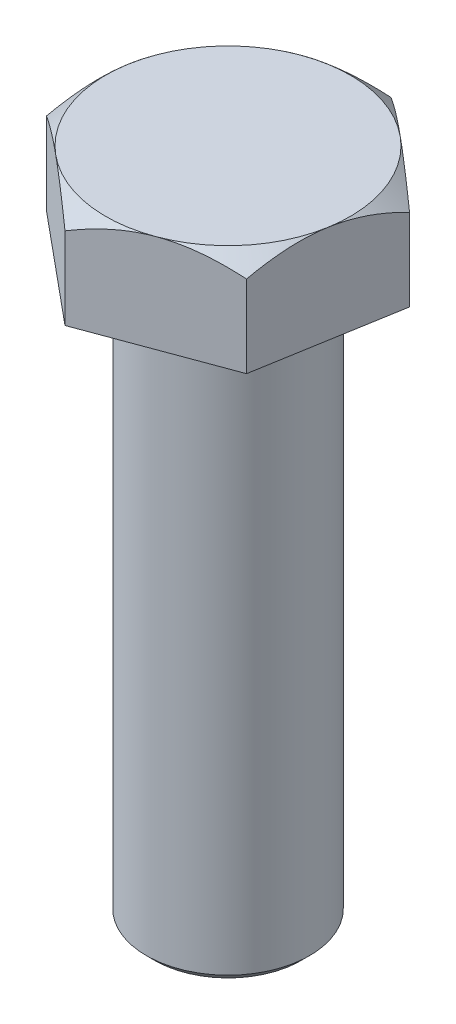
ISO-10303-21;
HEADER;
FILE_DESCRIPTION(('STEP AP214'),'2;1');
FILE_NAME('part.step','',(''),(''),'','','');
FILE_SCHEMA(('AUTOMOTIVE_DESIGN { 1 0 10303 214 1 1 1 1 }'));
ENDSEC;
DATA;
#1=APPLICATION_CONTEXT('core data for automotive mechanical design processes');
#2=APPLICATION_PROTOCOL_DEFINITION('international standard','automotive_design',2000,#1);
#3=PRODUCT_CONTEXT('',#1,'mechanical');
#4=PRODUCT('Part','Part','',(#3));
#5=PRODUCT_RELATED_PRODUCT_CATEGORY('part','',(#4));
#6=PRODUCT_DEFINITION_FORMATION('','',#4);
#7=PRODUCT_DEFINITION_CONTEXT('part definition',#1,'design');
#8=PRODUCT_DEFINITION('design','',#6,#7);
#9=PRODUCT_DEFINITION_SHAPE('','',#8);
#10=(LENGTH_UNIT() NAMED_UNIT(*) SI_UNIT(.MILLI.,.METRE.));
#11=(NAMED_UNIT(*) PLANE_ANGLE_UNIT() SI_UNIT($,.RADIAN.));
#12=(NAMED_UNIT(*) SI_UNIT($,.STERADIAN.) SOLID_ANGLE_UNIT());
#13=UNCERTAINTY_MEASURE_WITH_UNIT(LENGTH_MEASURE(1.E-05),#10,'distance_accuracy_value','');
#14=(GEOMETRIC_REPRESENTATION_CONTEXT(3) GLOBAL_UNCERTAINTY_ASSIGNED_CONTEXT((#13)) GLOBAL_UNIT_ASSIGNED_CONTEXT((#10,
#11,#12)) REPRESENTATION_CONTEXT('',''));
#15=CARTESIAN_POINT('',(0.,0.,0.));
#16=DIRECTION('',(0.,0.,1.));
#17=DIRECTION('',(1.,0.,0.));
#18=AXIS2_PLACEMENT_3D('',#15,#16,#17);
#19=CARTESIAN_POINT('',(-2.91048949961623,82.,17.0742218233401));
#20=DIRECTION('',(-0.347365853314628,0.,-0.937729685970856));
#21=DIRECTION('',(-0.937729685970856,0.,0.347365853314628));
#22=AXIS2_PLACEMENT_3D('',#19,#20,#21);
#23=PLANE('',#22);
#24=CARTESIAN_POINT('',(-2.91068949961623,80.0527730466816,17.0742959099044));
#25=CARTESIAN_POINT('',(-2.63722849280806,80.1751074607622,16.9729969776008));
#26=CARTESIAN_POINT('',(-2.36224444762258,80.2935214943959,16.871133861894));
#27=CARTESIAN_POINT('',(-1.80896899522368,80.5214922688724,16.6661824750329));
#28=CARTESIAN_POINT('',(-1.53067654049819,80.6310461138338,16.5630938158457));
#29=CARTESIAN_POINT('',(-0.689052885007393,80.9453954134312,16.2513287905584));
#30=CARTESIAN_POINT('',(-0.120595171194301,81.1351403804428,16.0407533957659));
#31=CARTESIAN_POINT('',(0.738870698550772,81.3814990590712,15.7223790287119));
#32=CARTESIAN_POINT('',(1.02519061514896,81.4569879752598,15.6163167341742));
#33=CARTESIAN_POINT('',(1.60064831431089,81.5944879006538,15.403148315059));
#34=CARTESIAN_POINT('',(1.88978567292479,81.6565009058753,15.2960423475263));
#35=CARTESIAN_POINT('',(2.47017506675641,81.7658776155034,15.0810470668401));
#36=CARTESIAN_POINT('',(2.76142448535048,81.8132570450953,14.9731587229699));
#37=CARTESIAN_POINT('',(3.34578219260528,81.8925108979478,14.756693448746));
#38=CARTESIAN_POINT('',(3.63889046594452,81.9243854488387,14.6481165240679));
#39=CARTESIAN_POINT('',(4.23132784873439,81.9723494228135,14.4286582728393));
#40=CARTESIAN_POINT('',(4.53067715063065,81.9881575070818,14.3177694663442));
#41=CARTESIAN_POINT('',(5.12974309034249,82.0026445803845,14.095855780073));
#42=CARTESIAN_POINT('',(5.42945972941784,82.0013235105099,13.9848308998303));
#43=CARTESIAN_POINT('',(6.02852063510496,81.9815794471626,13.762919078327));
#44=CARTESIAN_POINT('',(6.32786469164568,81.9631492490832,13.6520322148838));
#45=CARTESIAN_POINT('',(6.92522915410048,81.9096078749881,13.4307488116335));
#46=CARTESIAN_POINT('',(7.22324955480276,81.8744966333507,13.3203522737571));
#47=CARTESIAN_POINT('',(7.81729273779697,81.7883628980627,13.1002991814282));
#48=CARTESIAN_POINT('',(8.11331525256522,81.7373383151148,12.9906427260752));
#49=CARTESIAN_POINT('',(8.70278219758385,81.620418479962,12.7722848224911));
#50=CARTESIAN_POINT('',(8.99622621876246,81.5545209109178,12.6635835257936));
#51=CARTESIAN_POINT('',(9.87185097708019,81.3363504567128,12.3392233760544));
#52=CARTESIAN_POINT('',(10.4496059822361,81.1635569490721,12.125203959398));
#53=CARTESIAN_POINT('',(11.4126914110942,80.834573899571,11.7684455067062));
#54=CARTESIAN_POINT('',(11.8016625832438,80.6901081839901,11.6243578179511));
#55=CARTESIAN_POINT('',(12.3796979874146,80.4602652118119,11.4102345322966));
#56=CARTESIAN_POINT('',(12.5711265983243,80.3816164314127,11.3393230918546));
#57=CARTESIAN_POINT('',(12.9525071422213,80.2201971441955,11.1980472209396));
#58=CARTESIAN_POINT('',(13.1424586866377,80.1374255925657,11.1276829344061));
#59=CARTESIAN_POINT('',(13.3316650990551,80.0527730466816,11.0575946692213));
#60=B_SPLINE_CURVE_WITH_KNOTS('',3,(#24,#25,#26,#27,#28,#29,#30,#31,#32,#33,#34,#35,#36,#37,#38,
#39,#40,#41,#42,#43,#44,#45,#46,#47,#48,#49,#50,#51,#52,#53,#54,#55,#56,#57,#58,#59),
.UNSPECIFIED.,.F.,.F.,(4,2,2,2,2,2,2,2,2,2,2,2,2,2,2,2,2,4),(0.,0.948638219323454,
1.89758525081885,3.80110561467445,4.74444433951472,5.68764324413826,6.62982503574581,
7.57199907154818,8.53040109469999,9.48880641389845,10.4476154980877,11.4064283541823,
12.3653671479429,13.3244554236069,15.2417253713303,16.5590477208573,17.2153050562089,
17.8717295580449),.UNSPECIFIED.);
#61=CARTESIAN_POINT('',(-2.91048949961623,80.0528625295457,17.0742218233401));
#62=VERTEX_POINT('',#61);
#63=CARTESIAN_POINT('',(5.21048779971942,82.,14.0659452895628));
#64=VERTEX_POINT('',#63);
#65=EDGE_CURVE('E257',#62,#64,#60,.T.);
#66=ORIENTED_EDGE('',*,*,#65,.F.);
#67=DIRECTION('',(0.,-1.,0.));
#68=VECTOR('',#67,1.);
#69=CARTESIAN_POINT('',(-2.91048949961623,82.,17.0742218233401));
#70=LINE('',#69,#68);
#71=CARTESIAN_POINT('',(-2.91048949961623,70.,17.0742218233401));
#72=VERTEX_POINT('',#71);
#73=EDGE_CURVE('E240',#62,#72,#70,.T.);
#74=ORIENTED_EDGE('',*,*,#73,.T.);
#75=DIRECTION('',(0.937729685970856,0.,-0.347365853314628));
#76=VECTOR('',#75,1.);
#77=CARTESIAN_POINT('',(-2.91048949961623,70.,17.0742218233401));
#78=LINE('',#77,#76);
#79=CARTESIAN_POINT('',(13.3314650990551,70.,11.0576687557856));
#80=VERTEX_POINT('',#79);
#81=EDGE_CURVE('E255',#72,#80,#78,.T.);
#82=ORIENTED_EDGE('',*,*,#81,.T.);
#83=DIRECTION('',(0.,-1.,0.));
#84=VECTOR('',#83,1.);
#85=CARTESIAN_POINT('',(13.3314650990551,82.,11.0576687557856));
#86=LINE('',#85,#84);
#87=CARTESIAN_POINT('',(13.3314650990551,80.0528625295457,11.0576687557856));
#88=VERTEX_POINT('',#87);
#89=EDGE_CURVE('E229',#88,#80,#86,.T.);
#90=ORIENTED_EDGE('',*,*,#89,.F.);
#91=EDGE_CURVE('E110',#64,#88,#60,.T.);
#92=ORIENTED_EDGE('',*,*,#91,.F.);
#93=EDGE_LOOP('',(#66,#74,#82,#90,#92));
#94=FACE_BOUND('',#93,.T.);
#95=ADVANCED_FACE('F35',(#94),#23,.F.);
#96=CARTESIAN_POINT('',(13.3314650990551,82.,11.0576687557856));
#97=DIRECTION('',(-0.985780656590879,0.,-0.168037189607701));
#98=DIRECTION('',(-0.168037189607701,0.,0.98578065659088));
#99=AXIS2_PLACEMENT_3D('',#96,#97,#98);
#100=PLANE('',#99);
#101=CARTESIAN_POINT('',(13.3314310068484,80.0527774084797,11.0578687557856));
#102=CARTESIAN_POINT('',(13.3804340439078,80.1751116685097,10.7703952140046));
#103=CARTESIAN_POINT('',(13.4297100028762,80.2935255462614,10.481320591301));
#104=CARTESIAN_POINT('',(13.5288545857024,80.5214960056934,9.89969451088428));
#105=CARTESIAN_POINT('',(13.5787233972697,80.6310496914908,9.60714195198324));
#106=CARTESIAN_POINT('',(13.7295387374369,80.9453985074171,8.72239229983152));
#107=CARTESIAN_POINT('',(13.8314039146737,81.1351431458735,8.12480600637662));
#108=CARTESIAN_POINT('',(13.9854164998945,81.3815013336631,7.2212998971836));
#109=CARTESIAN_POINT('',(14.0367237966313,81.456990087447,6.92030854649965));
#110=CARTESIAN_POINT('',(14.139843338687,81.5944896902701,6.31536359287176));
#111=CARTESIAN_POINT('',(14.191655508036,81.6565025353249,6.01141043560062));
#112=CARTESIAN_POINT('',(14.295658786666,81.7658789298141,5.40128109140657));
#113=CARTESIAN_POINT('',(14.3478494270609,81.8132582044176,5.09510765517829));
#114=CARTESIAN_POINT('',(14.452563808196,81.8925117555329,4.48080666840968));
#115=CARTESIAN_POINT('',(14.5050875461906,81.9243861596748,4.17267913397589));
#116=CARTESIAN_POINT('',(14.6112497653494,81.9723498482744,3.54988448743512));
#117=CARTESIAN_POINT('',(14.6648918648812,81.9881577949395,3.23519614837816));
#118=CARTESIAN_POINT('',(14.7722418877871,82.002644610361,2.6054333184221));
#119=CARTESIAN_POINT('',(14.8259498113869,82.0013234202078,2.29035882619869));
#120=CARTESIAN_POINT('',(14.9332989301152,81.9815791364011,1.66060130054927));
#121=CARTESIAN_POINT('',(14.9869400875994,81.9631488381329,1.34591848796156));
#122=CARTESIAN_POINT('',(15.093985209366,81.9096072855675,0.71794434327188));
#123=CARTESIAN_POINT('',(15.1473891727145,81.8744959656491,0.404653016648746));
#124=CARTESIAN_POINT('',(15.253839134041,81.7883620965521,-0.21982965302379));
#125=CARTESIAN_POINT('',(15.3068850840822,81.7373374581819,-0.53102071485477));
#126=CARTESIAN_POINT('',(15.4125150023892,81.6204175342938,-1.1506926485944));
#127=CARTESIAN_POINT('',(15.4650988973512,81.554519931942,-1.45917309047011));
#128=CARTESIAN_POINT('',(15.6220070534571,81.3363494092117,-2.37966590227922));
#129=CARTESIAN_POINT('',(15.7255382426748,81.1635558975606,-2.98702576067084));
#130=CARTESIAN_POINT('',(15.898118619401,80.8345735698014,-3.99945876720383));
#131=CARTESIAN_POINT('',(15.9678202188422,80.6901086676054,-4.40835925300112));
#132=CARTESIAN_POINT('',(16.0714011449119,80.4602670552488,-5.01601088981842));
#133=CARTESIAN_POINT('',(16.1057041534893,80.3816187498422,-5.21724754699767));
#134=CARTESIAN_POINT('',(16.1740455591232,80.2202004543605,-5.61816853285409));
#135=CARTESIAN_POINT('',(16.2080838865501,80.137429419484,-5.81785245305382));
#136=CARTESIAN_POINT('',(16.241988690878,80.0527774084797,-6.01675306755454));
#137=B_SPLINE_CURVE_WITH_KNOTS('',3,(#101,#102,#103,#104,#105,#106,#107,#108,#109,#110,#111,
#112,#113,#114,#115,#116,#117,#118,#119,#120,#121,#122,#123,#124,#125,#126,#127,#128,#129,#130,
#131,#132,#133,#134,#135,#136),.UNSPECIFIED.,.F.,.F.,(4,2,2,2,2,2,2,2,2,2,2,2,2,2,2,2,2,4),(0.,
0.948637750852713,1.89758431376006,3.80110372841824,4.74444198780448,5.68764042706563,
6.62982175449487,7.57199532611947,8.5303968302554,9.48880163047824,10.4476101964009,
11.4064225341971,12.3653608033915,13.3244485542859,15.2417174502279,16.5590324667956,
17.2152861578204,17.8717070143951),.UNSPECIFIED.);
#138=CARTESIAN_POINT('',(14.7867098488632,82.,2.52055784411552));
#139=VERTEX_POINT('',#138);
#140=EDGE_CURVE('E106',#88,#139,#137,.T.);
#141=ORIENTED_EDGE('',*,*,#140,.F.);
#142=ORIENTED_EDGE('',*,*,#89,.T.);
#143=DIRECTION('',(0.168037189607701,0.,-0.98578065659088));
#144=VECTOR('',#143,1.);
#145=CARTESIAN_POINT('',(13.3314650990551,70.,11.0576687557856));
#146=LINE('',#145,#144);
#147=CARTESIAN_POINT('',(16.2419545986713,70.,-6.01655306755454));
#148=VERTEX_POINT('',#147);
#149=EDGE_CURVE('E254',#80,#148,#146,.T.);
#150=ORIENTED_EDGE('',*,*,#149,.T.);
#151=DIRECTION('',(0.,-1.,0.));
#152=VECTOR('',#151,1.);
#153=CARTESIAN_POINT('',(16.2419545986713,82.,-6.01655306755454));
#154=LINE('',#153,#152);
#155=CARTESIAN_POINT('',(16.2419545986713,80.0528625295457,-6.01655306755454));
#156=VERTEX_POINT('',#155);
#157=EDGE_CURVE('E134',#156,#148,#154,.T.);
#158=ORIENTED_EDGE('',*,*,#157,.F.);
#159=EDGE_CURVE('E114',#139,#156,#137,.T.);
#160=ORIENTED_EDGE('',*,*,#159,.F.);
#161=EDGE_LOOP('',(#141,#142,#150,#158,#160));
#162=FACE_BOUND('',#161,.T.);
#163=ADVANCED_FACE('F132',(#162),#100,.F.);
#164=CARTESIAN_POINT('',(16.2419545986713,82.,-6.01655306755454));
#165=DIRECTION('',(-0.638414803276251,0.,0.769692496363155));
#166=DIRECTION('',(0.769692496363155,0.,0.638414803276251));
#167=AXIS2_PLACEMENT_3D('',#164,#165,#166);
#168=PLANE('',#167);
#169=CARTESIAN_POINT('',(16.2421545986713,80.0527535108043,-6.01638717927934));
#170=CARTESIAN_POINT('',(16.0176962855806,80.1750886148536,-6.20256219134276));
#171=CARTESIAN_POINT('',(15.7919878536772,80.2935033466592,-6.38977410367426));
#172=CARTESIAN_POINT('',(15.3378562852475,80.5214755321717,-6.76644961667527));
#173=CARTESIAN_POINT('',(15.1094322889166,80.6310300900033,-6.95591393050213));
#174=CARTESIAN_POINT('',(14.4186228872168,80.9453815558897,-7.52889983119814));
#175=CARTESIAN_POINT('',(13.952029601888,81.1351279944501,-7.91591160781117));
#176=CARTESIAN_POINT('',(13.2465751490001,81.3814888714715,-8.50104471991603));
#177=CARTESIAN_POINT('',(13.0115621367057,81.4569785150467,-8.69597423621016));
#178=CARTESIAN_POINT('',(12.5392231738735,81.5944798851873,-9.08775171547768));
#179=CARTESIAN_POINT('',(12.3018975713189,81.6564936077718,-9.2845993898193));
#180=CARTESIAN_POINT('',(11.8255106068562,81.7658717288613,-9.67973444912917));
#181=CARTESIAN_POINT('',(11.5864513927174,81.8132518526228,-9.87802005264871));
#182=CARTESIAN_POINT('',(11.1068071693372,81.892507056913,-10.2758568172771));
#183=CARTESIAN_POINT('',(10.8662221726721,81.9243822650718,-10.4754079679547));
#184=CARTESIAN_POINT('',(10.3799460020094,81.9723475172014,-10.8787455440625));
#185=CARTESIAN_POINT('',(10.1342382532914,81.9881562177754,-11.0825457172518));
#186=CARTESIAN_POINT('',(9.64252122037137,82.0026444460923,-11.490396169637));
#187=CARTESIAN_POINT('',(9.3965119351353,82.0013239149293,-11.6944464496907));
#188=CARTESIAN_POINT('',(8.90479899104735,81.9815808389896,-12.1022935106294));
#189=CARTESIAN_POINT('',(8.65909550461277,81.9631510896425,-12.3060901485044));
#190=CARTESIAN_POINT('',(8.16877497719508,81.9096105148924,-12.7127822814442));
#191=CARTESIAN_POINT('',(7.92415794048993,81.8744996238649,-12.9156777729606));
#192=CARTESIAN_POINT('',(7.43656350823905,81.7883664878905,-13.3201087697741));
#193=CARTESIAN_POINT('',(7.19358633232558,81.7373421531724,-13.5216440928991));
#194=CARTESIAN_POINT('',(6.70974808431947,81.6204227154544,-13.9229595550842));
#195=CARTESIAN_POINT('',(6.4688873479961,81.5545252955913,-14.1227394156433));
#196=CARTESIAN_POINT('',(5.75016892298487,81.3363551483041,-14.7188742150374));
#197=CARTESIAN_POINT('',(5.27594390426297,81.1635616586271,-15.1122160670972));
#198=CARTESIAN_POINT('',(4.48542997935495,80.8345753765618,-15.7679010247159));
#199=CARTESIAN_POINT('',(4.16615283862262,80.6901060179509,-16.0327226956485));
#200=CARTESIAN_POINT('',(3.69168721538254,80.4602569553264,-16.426264115051));
#201=CARTESIAN_POINT('',(3.5345579434751,80.3816060475016,-16.5565936345509));
#202=CARTESIAN_POINT('',(3.22151152286955,80.2201823184395,-16.8162472884082));
#203=CARTESIAN_POINT('',(3.06559469312752,80.1374084523426,-16.9455711582102));
#204=CARTESIAN_POINT('',(2.91028949961624,80.0527535108043,-17.0743877116153));
#205=B_SPLINE_CURVE_WITH_KNOTS('',3,(#169,#170,#171,#172,#173,#174,#175,#176,#177,#178,#179,
#180,#181,#182,#183,#184,#185,#186,#187,#188,#189,#190,#191,#192,#193,#194,#195,#196,#197,#198,
#199,#200,#201,#202,#203,#204),.UNSPECIFIED.,.F.,.F.,(4,2,2,2,2,2,2,2,2,2,2,2,2,2,2,2,2,4),(0.,
0.948640317532585,1.89758944776246,3.8011140629285,4.74445487246712,5.68765586137856,
6.62983973197081,7.57201584675546,8.53042019450177,9.48882783811433,10.4476392435421,
11.4064544210174,12.3653955642311,13.3244861902592,15.2417608487532,16.5591160415004,
17.215389699242,17.8718305276536),.UNSPECIFIED.);
#206=CARTESIAN_POINT('',(9.57622204914377,82.,-11.5453874454473));
#207=VERTEX_POINT('',#206);
#208=EDGE_CURVE('E121',#156,#207,#205,.T.);
#209=ORIENTED_EDGE('',*,*,#208,.F.);
#210=ORIENTED_EDGE('',*,*,#157,.T.);
#211=DIRECTION('',(-0.769692496363155,0.,-0.638414803276251));
#212=VECTOR('',#211,1.);
#213=CARTESIAN_POINT('',(16.2419545986713,70.,-6.01655306755454));
#214=LINE('',#213,#212);
#215=CARTESIAN_POINT('',(2.91048949961623,70.,-17.0742218233401));
#216=VERTEX_POINT('',#215);
#217=EDGE_CURVE('E251',#148,#216,#214,.T.);
#218=ORIENTED_EDGE('',*,*,#217,.T.);
#219=DIRECTION('',(0.,-1.,0.));
#220=VECTOR('',#219,1.);
#221=CARTESIAN_POINT('',(2.91048949961623,82.,-17.0742218233401));
#222=LINE('',#221,#220);
#223=CARTESIAN_POINT('',(2.91048949961623,80.0528625295457,-17.0742218233401));
#224=VERTEX_POINT('',#223);
#225=EDGE_CURVE('E234',#224,#216,#222,.T.);
#226=ORIENTED_EDGE('',*,*,#225,.F.);
#227=EDGE_CURVE('E135',#207,#224,#205,.T.);
#228=ORIENTED_EDGE('',*,*,#227,.F.);
#229=EDGE_LOOP('',(#209,#210,#218,#226,#228));
#230=FACE_BOUND('',#229,.T.);
#231=ADVANCED_FACE('F195',(#230),#168,.F.);
#232=CARTESIAN_POINT('',(2.91048949961623,82.,-17.0742218233401));
#233=DIRECTION('',(0.347365853314628,0.,0.937729685970856));
#234=DIRECTION('',(0.937729685970856,0.,-0.347365853314628));
#235=AXIS2_PLACEMENT_3D('',#232,#233,#234);
#236=PLANE('',#235);
#237=CARTESIAN_POINT('',(2.91068949961623,80.0527730466816,-17.0742959099044));
#238=CARTESIAN_POINT('',(2.63722849280806,80.1751074607622,-16.9729969776008));
#239=CARTESIAN_POINT('',(2.36224444762258,80.293521494396,-16.871133861894));
#240=CARTESIAN_POINT('',(1.80896899522368,80.5214922688724,-16.6661824750329));
#241=CARTESIAN_POINT('',(1.53067654049819,80.6310461138338,-16.5630938158457));
#242=CARTESIAN_POINT('',(0.689052885007392,80.9453954134312,-16.2513287905584));
#243=CARTESIAN_POINT('',(0.120595171194303,81.1351403804428,-16.0407533957659));
#244=CARTESIAN_POINT('',(-0.738870698550774,81.3814990590712,-15.7223790287118));
#245=CARTESIAN_POINT('',(-1.02519061514897,81.4569879752598,-15.6163167341742));
#246=CARTESIAN_POINT('',(-1.6006483143109,81.5944879006538,-15.403148315059));
#247=CARTESIAN_POINT('',(-1.88978567292479,81.6565009058753,-15.2960423475263));
#248=CARTESIAN_POINT('',(-2.47017506675641,81.7658776155034,-15.0810470668401));
#249=CARTESIAN_POINT('',(-2.76142448535048,81.8132570450953,-14.9731587229699));
#250=CARTESIAN_POINT('',(-3.34578219260528,81.8925108979478,-14.756693448746));
#251=CARTESIAN_POINT('',(-3.63889046594452,81.9243854488387,-14.6481165240679));
#252=CARTESIAN_POINT('',(-4.23132784873439,81.9723494228135,-14.4286582728393));
#253=CARTESIAN_POINT('',(-4.53067715063065,81.9881575070818,-14.3177694663442));
#254=CARTESIAN_POINT('',(-5.12974309034249,82.0026445803845,-14.095855780073));
#255=CARTESIAN_POINT('',(-5.42945972941785,82.0013235105099,-13.9848308998303));
#256=CARTESIAN_POINT('',(-6.02852063510496,81.9815794471626,-13.762919078327));
#257=CARTESIAN_POINT('',(-6.32786469164568,81.9631492490832,-13.6520322148838));
#258=CARTESIAN_POINT('',(-6.92522915410048,81.9096078749881,-13.4307488116335));
#259=CARTESIAN_POINT('',(-7.22324955480276,81.8744966333507,-13.3203522737571));
#260=CARTESIAN_POINT('',(-7.81729273779697,81.7883628980627,-13.1002991814282));
#261=CARTESIAN_POINT('',(-8.11331525256522,81.7373383151148,-12.9906427260752));
#262=CARTESIAN_POINT('',(-8.70278219758385,81.620418479962,-12.7722848224911));
#263=CARTESIAN_POINT('',(-8.99622621876246,81.5545209109178,-12.6635835257936));
#264=CARTESIAN_POINT('',(-9.87185097708019,81.3363504567128,-12.3392233760544));
#265=CARTESIAN_POINT('',(-10.4496059822361,81.1635569490721,-12.125203959398));
#266=CARTESIAN_POINT('',(-11.4126914110942,80.834573899571,-11.7684455067062));
#267=CARTESIAN_POINT('',(-11.8016625832438,80.69010818399,-11.6243578179511));
#268=CARTESIAN_POINT('',(-12.3796979874146,80.4602652118119,-11.4102345322966));
#269=CARTESIAN_POINT('',(-12.5711265983243,80.3816164314126,-11.3393230918546));
#270=CARTESIAN_POINT('',(-12.9525071422213,80.2201971441955,-11.1980472209396));
#271=CARTESIAN_POINT('',(-13.1424586866377,80.1374255925657,-11.1276829344061));
#272=CARTESIAN_POINT('',(-13.3316650990551,80.0527730466816,-11.0575946692213));
#273=B_SPLINE_CURVE_WITH_KNOTS('',3,(#237,#238,#239,#240,#241,#242,#243,#244,#245,#246,#247,
#248,#249,#250,#251,#252,#253,#254,#255,#256,#257,#258,#259,#260,#261,#262,#263,#264,#265,#266,
#267,#268,#269,#270,#271,#272),.UNSPECIFIED.,.F.,.F.,(4,2,2,2,2,2,2,2,2,2,2,2,2,2,2,2,2,4),(0.,
0.948638219323455,1.89758525081884,3.80110561467445,4.74444433951472,5.68764324413826,
6.6298250357458,7.57199907154818,8.53040109469999,9.48880641389844,10.4476154980877,
11.4064283541823,12.3653671479429,13.3244554236069,15.2417253713303,16.5590477208573,
17.2153050562089,17.8717295580449),.UNSPECIFIED.);
#274=CARTESIAN_POINT('',(-5.21048779971942,82.,-14.0659452895628));
#275=VERTEX_POINT('',#274);
#276=EDGE_CURVE('E189',#224,#275,#273,.T.);
#277=ORIENTED_EDGE('',*,*,#276,.F.);
#278=ORIENTED_EDGE('',*,*,#225,.T.);
#279=DIRECTION('',(-0.937729685970856,0.,0.347365853314628));
#280=VECTOR('',#279,1.);
#281=CARTESIAN_POINT('',(2.91048949961623,70.,-17.0742218233401));
#282=LINE('',#281,#280);
#283=CARTESIAN_POINT('',(-13.3314650990551,70.,-11.0576687557856));
#284=VERTEX_POINT('',#283);
#285=EDGE_CURVE('E248',#216,#284,#282,.T.);
#286=ORIENTED_EDGE('',*,*,#285,.T.);
#287=DIRECTION('',(0.,-1.,0.));
#288=VECTOR('',#287,1.);
#289=CARTESIAN_POINT('',(-13.3314650990551,82.,-11.0576687557856));
#290=LINE('',#289,#288);
#291=CARTESIAN_POINT('',(-13.3314650990551,80.0528625295457,-11.0576687557856));
#292=VERTEX_POINT('',#291);
#293=EDGE_CURVE('E236',#292,#284,#290,.T.);
#294=ORIENTED_EDGE('',*,*,#293,.F.);
#295=EDGE_CURVE('E183',#275,#292,#273,.T.);
#296=ORIENTED_EDGE('',*,*,#295,.F.);
#297=EDGE_LOOP('',(#277,#278,#286,#294,#296));
#298=FACE_BOUND('',#297,.T.);
#299=ADVANCED_FACE('F191',(#298),#236,.F.);
#300=CARTESIAN_POINT('',(-13.3314650990551,82.,-11.0576687557856));
#301=DIRECTION('',(0.985780656590879,0.,0.168037189607701));
#302=DIRECTION('',(0.168037189607701,0.,-0.98578065659088));
#303=AXIS2_PLACEMENT_3D('',#300,#301,#302);
#304=PLANE('',#303);
#305=CARTESIAN_POINT('',(-13.3314310068484,80.0527774084797,-11.0578687557856));
#306=CARTESIAN_POINT('',(-13.3804340439078,80.1751116685097,-10.7703952140046));
#307=CARTESIAN_POINT('',(-13.4297100028762,80.2935255462614,-10.481320591301));
#308=CARTESIAN_POINT('',(-13.5288545857024,80.5214960056934,-9.89969451088428));
#309=CARTESIAN_POINT('',(-13.5787233972697,80.6310496914908,-9.60714195198324));
#310=CARTESIAN_POINT('',(-13.7295387374369,80.9453985074171,-8.72239229983151));
#311=CARTESIAN_POINT('',(-13.8314039146737,81.1351431458735,-8.12480600637661));
#312=CARTESIAN_POINT('',(-13.9854164998945,81.3815013336631,-7.22129989718359));
#313=CARTESIAN_POINT('',(-14.0367237966313,81.456990087447,-6.92030854649964));
#314=CARTESIAN_POINT('',(-14.139843338687,81.5944896902701,-6.31536359287175));
#315=CARTESIAN_POINT('',(-14.191655508036,81.6565025353249,-6.01141043560061));
#316=CARTESIAN_POINT('',(-14.295658786666,81.7658789298141,-5.40128109140656));
#317=CARTESIAN_POINT('',(-14.3478494270609,81.8132582044176,-5.09510765517828));
#318=CARTESIAN_POINT('',(-14.452563808196,81.8925117555329,-4.48080666840967));
#319=CARTESIAN_POINT('',(-14.5050875461906,81.9243861596748,-4.17267913397588));
#320=CARTESIAN_POINT('',(-14.6112497653494,81.9723498482744,-3.54988448743511));
#321=CARTESIAN_POINT('',(-14.6648918648812,81.9881577949395,-3.23519614837815));
#322=CARTESIAN_POINT('',(-14.7722418877871,82.002644610361,-2.60543331842209));
#323=CARTESIAN_POINT('',(-14.8259498113869,82.0013234202078,-2.29035882619868));
#324=CARTESIAN_POINT('',(-14.9332989301152,81.9815791364011,-1.66060130054926));
#325=CARTESIAN_POINT('',(-14.9869400875994,81.9631488381329,-1.34591848796155));
#326=CARTESIAN_POINT('',(-15.093985209366,81.9096072855675,-0.717944343271866));
#327=CARTESIAN_POINT('',(-15.1473891727145,81.8744959656491,-0.404653016648732));
#328=CARTESIAN_POINT('',(-15.253839134041,81.7883620965521,0.219829653023805));
#329=CARTESIAN_POINT('',(-15.3068850840822,81.7373374581819,0.531020714854785));
#330=CARTESIAN_POINT('',(-15.4125150023892,81.6204175342938,1.15069264859441));
#331=CARTESIAN_POINT('',(-15.4650988973512,81.554519931942,1.45917309047012));
#332=CARTESIAN_POINT('',(-15.6220070534571,81.3363494092117,2.37966590227924));
#333=CARTESIAN_POINT('',(-15.7255382426748,81.1635558975606,2.98702576067085));
#334=CARTESIAN_POINT('',(-15.898118619401,80.8345735698014,3.99945876720384));
#335=CARTESIAN_POINT('',(-15.9678202188422,80.6901086676054,4.40835925300113));
#336=CARTESIAN_POINT('',(-16.0714011449119,80.4602670552488,5.01601088981842));
#337=CARTESIAN_POINT('',(-16.1057041534893,80.3816187498422,5.21724754699768));
#338=CARTESIAN_POINT('',(-16.1740455591231,80.2202004543605,5.6181685328541));
#339=CARTESIAN_POINT('',(-16.2080838865501,80.137429419484,5.81785245305382));
#340=CARTESIAN_POINT('',(-16.241988690878,80.0527774084797,6.01675306755454));
#341=B_SPLINE_CURVE_WITH_KNOTS('',3,(#305,#306,#307,#308,#309,#310,#311,#312,#313,#314,#315,
#316,#317,#318,#319,#320,#321,#322,#323,#324,#325,#326,#327,#328,#329,#330,#331,#332,#333,#334,
#335,#336,#337,#338,#339,#340),.UNSPECIFIED.,.F.,.F.,(4,2,2,2,2,2,2,2,2,2,2,2,2,2,2,2,2,4),(0.,
0.948637750852715,1.89758431376007,3.80110372841825,4.74444198780449,5.68764042706564,
6.62982175449488,7.57199532611948,8.53039683025541,9.48880163047825,10.447610196401,
11.4064225341971,12.3653608033915,13.3244485542859,15.2417174502279,16.5590324667956,
17.2152861578204,17.8717070143951),.UNSPECIFIED.);
#342=CARTESIAN_POINT('',(-14.7867098488632,82.,-2.52055784411551));
#343=VERTEX_POINT('',#342);
#344=EDGE_CURVE('E190',#292,#343,#341,.T.);
#345=ORIENTED_EDGE('',*,*,#344,.F.);
#346=ORIENTED_EDGE('',*,*,#293,.T.);
#347=DIRECTION('',(-0.168037189607701,0.,0.985780656590879));
#348=VECTOR('',#347,1.);
#349=CARTESIAN_POINT('',(-13.3314650990551,70.,-11.0576687557856));
#350=LINE('',#349,#348);
#351=CARTESIAN_POINT('',(-16.2419545986713,70.,6.01655306755453));
#352=VERTEX_POINT('',#351);
#353=EDGE_CURVE('E245',#284,#352,#350,.T.);
#354=ORIENTED_EDGE('',*,*,#353,.T.);
#355=DIRECTION('',(0.,-1.,0.));
#356=VECTOR('',#355,1.);
#357=CARTESIAN_POINT('',(-16.2419545986713,82.,6.01655306755453));
#358=LINE('',#357,#356);
#359=CARTESIAN_POINT('',(-16.2419545986713,80.0528625295457,6.01655306755453));
#360=VERTEX_POINT('',#359);
#361=EDGE_CURVE('E238',#360,#352,#358,.T.);
#362=ORIENTED_EDGE('',*,*,#361,.F.);
#363=EDGE_CURVE('E176',#343,#360,#341,.T.);
#364=ORIENTED_EDGE('',*,*,#363,.F.);
#365=EDGE_LOOP('',(#345,#346,#354,#362,#364));
#366=FACE_BOUND('',#365,.T.);
#367=ADVANCED_FACE('F194',(#366),#304,.F.);
#368=CARTESIAN_POINT('',(-16.2419545986713,82.,6.01655306755453));
#369=DIRECTION('',(0.638414803276251,0.,-0.769692496363155));
#370=DIRECTION('',(-0.769692496363155,0.,-0.638414803276251));
#371=AXIS2_PLACEMENT_3D('',#368,#369,#370);
#372=PLANE('',#371);
#373=CARTESIAN_POINT('',(-16.2421545986713,80.0527535108043,6.01638717927934));
#374=CARTESIAN_POINT('',(-16.0176962855806,80.1750886148536,6.20256219134275));
#375=CARTESIAN_POINT('',(-15.7919878536772,80.2935033466592,6.38977410367426));
#376=CARTESIAN_POINT('',(-15.3378562852475,80.5214755321717,6.76644961667526));
#377=CARTESIAN_POINT('',(-15.1094322889166,80.6310300900033,6.95591393050213));
#378=CARTESIAN_POINT('',(-14.4186228872168,80.9453815558897,7.52889983119813));
#379=CARTESIAN_POINT('',(-13.952029601888,81.1351279944501,7.91591160781117));
#380=CARTESIAN_POINT('',(-13.2465751490001,81.3814888714715,8.50104471991603));
#381=CARTESIAN_POINT('',(-13.0115621367058,81.4569785150467,8.69597423621015));
#382=CARTESIAN_POINT('',(-12.5392231738735,81.5944798851873,9.08775171547768));
#383=CARTESIAN_POINT('',(-12.3018975713189,81.6564936077718,9.2845993898193));
#384=CARTESIAN_POINT('',(-11.8255106068562,81.7658717288613,9.67973444912917));
#385=CARTESIAN_POINT('',(-11.5864513927174,81.8132518526228,9.87802005264871));
#386=CARTESIAN_POINT('',(-11.1068071693372,81.892507056913,10.2758568172771));
#387=CARTESIAN_POINT('',(-10.8662221726721,81.9243822650718,10.4754079679547));
#388=CARTESIAN_POINT('',(-10.3799460020094,81.9723475172014,10.8787455440625));
#389=CARTESIAN_POINT('',(-10.1342382532914,81.9881562177754,11.0825457172518));
#390=CARTESIAN_POINT('',(-9.64252122037137,82.0026444460923,11.490396169637));
#391=CARTESIAN_POINT('',(-9.3965119351353,82.0013239149293,11.6944464496907));
#392=CARTESIAN_POINT('',(-8.90479899104735,81.9815808389896,12.1022935106294));
#393=CARTESIAN_POINT('',(-8.65909550461277,81.9631510896425,12.3060901485044));
#394=CARTESIAN_POINT('',(-8.16877497719508,81.9096105148924,12.7127822814442));
#395=CARTESIAN_POINT('',(-7.92415794048993,81.8744996238649,12.9156777729606));
#396=CARTESIAN_POINT('',(-7.43656350823905,81.7883664878905,13.3201087697741));
#397=CARTESIAN_POINT('',(-7.19358633232558,81.7373421531724,13.5216440928991));
#398=CARTESIAN_POINT('',(-6.70974808431947,81.6204227154544,13.9229595550842));
#399=CARTESIAN_POINT('',(-6.4688873479961,81.5545252955913,14.1227394156433));
#400=CARTESIAN_POINT('',(-5.75016892298487,81.3363551483041,14.7188742150374));
#401=CARTESIAN_POINT('',(-5.27594390426297,81.1635616586271,15.1122160670972));
#402=CARTESIAN_POINT('',(-4.48542997935494,80.8345753765618,15.7679010247159));
#403=CARTESIAN_POINT('',(-4.16615283862261,80.6901060179509,16.0327226956486));
#404=CARTESIAN_POINT('',(-3.69168721538253,80.4602569553264,16.426264115051));
#405=CARTESIAN_POINT('',(-3.53455794347509,80.3816060475016,16.5565936345509));
#406=CARTESIAN_POINT('',(-3.22151152286954,80.2201823184395,16.8162472884082));
#407=CARTESIAN_POINT('',(-3.06559469312751,80.1374084523426,16.9455711582102));
#408=CARTESIAN_POINT('',(-2.91028949961622,80.0527535108043,17.0743877116153));
#409=B_SPLINE_CURVE_WITH_KNOTS('',3,(#373,#374,#375,#376,#377,#378,#379,#380,#381,#382,#383,
#384,#385,#386,#387,#388,#389,#390,#391,#392,#393,#394,#395,#396,#397,#398,#399,#400,#401,#402,
#403,#404,#405,#406,#407,#408),.UNSPECIFIED.,.F.,.F.,(4,2,2,2,2,2,2,2,2,2,2,2,2,2,2,2,2,4),(0.,
0.948640317532585,1.89758944776246,3.8011140629285,4.74445487246712,5.68765586137855,
6.62983973197081,7.57201584675546,8.53042019450177,9.48882783811433,10.4476392435421,
11.4064544210174,12.3653955642311,13.3244861902592,15.2417608487532,16.5591160415004,
17.215389699242,17.8718305276536),.UNSPECIFIED.);
#410=CARTESIAN_POINT('',(-9.57622204914377,82.,11.5453874454473));
#411=VERTEX_POINT('',#410);
#412=EDGE_CURVE('E283',#360,#411,#409,.T.);
#413=ORIENTED_EDGE('',*,*,#412,.F.);
#414=ORIENTED_EDGE('',*,*,#361,.T.);
#415=DIRECTION('',(0.769692496363155,0.,0.638414803276251));
#416=VECTOR('',#415,1.);
#417=CARTESIAN_POINT('',(-16.2419545986713,70.,6.01655306755453));
#418=LINE('',#417,#416);
#419=EDGE_CURVE('E242',#352,#72,#418,.T.);
#420=ORIENTED_EDGE('',*,*,#419,.T.);
#421=ORIENTED_EDGE('',*,*,#73,.F.);
#422=EDGE_CURVE('E129',#411,#62,#409,.T.);
#423=ORIENTED_EDGE('',*,*,#422,.F.);
#424=EDGE_LOOP('',(#413,#414,#420,#421,#423));
#425=FACE_BOUND('',#424,.T.);
#426=ADVANCED_FACE('F216',(#425),#372,.F.);
#427=CARTESIAN_POINT('',(0.,70.,0.));
#428=DIRECTION('',(0.,1.,0.));
#429=DIRECTION('',(-1.,0.,0.));
#430=AXIS2_PLACEMENT_3D('',#427,#428,#429);
#431=CYLINDRICAL_SURFACE('',#430,10.);
#432=CARTESIAN_POINT('',(0.,0.999999999999987,0.));
#433=DIRECTION('',(0.,1.,0.));
#434=DIRECTION('',(-1.,0.,0.));
#435=AXIS2_PLACEMENT_3D('',#432,#433,#434);
#436=CIRCLE('',#435,10.);
#437=CARTESIAN_POINT('',(-10.,0.999999999999987,0.));
#438=VERTEX_POINT('',#437);
#439=EDGE_CURVE('E43',#438,#438,#436,.T.);
#440=ORIENTED_EDGE('',*,*,#439,.T.);
#441=EDGE_LOOP('',(#440));
#442=FACE_BOUND('',#441,.T.);
#443=CARTESIAN_POINT('',(0.,70.,0.));
#444=DIRECTION('',(0.,1.,0.));
#445=DIRECTION('',(-1.,0.,0.));
#446=AXIS2_PLACEMENT_3D('',#443,#444,#445);
#447=CIRCLE('',#446,9.99999999999999);
#448=CARTESIAN_POINT('',(-9.99999999999999,70.,0.));
#449=VERTEX_POINT('',#448);
#450=EDGE_CURVE('E227',#449,#449,#447,.T.);
#451=ORIENTED_EDGE('',*,*,#450,.F.);
#452=EDGE_LOOP('',(#451));
#453=FACE_BOUND('',#452,.T.);
#454=ADVANCED_FACE('F213',(#442,#453),#431,.T.);
#455=CARTESIAN_POINT('',(10.,0.,0.));
#456=DIRECTION('',(0.,1.,0.));
#457=DIRECTION('',(-1.,0.,0.));
#458=AXIS2_PLACEMENT_3D('',#455,#456,#457);
#459=PLANE('',#458);
#460=CARTESIAN_POINT('',(0.,0.,0.));
#461=DIRECTION('',(0.,1.,0.));
#462=DIRECTION('',(-1.,0.,0.));
#463=AXIS2_PLACEMENT_3D('',#460,#461,#462);
#464=CIRCLE('',#463,9.00000000000001);
#465=CARTESIAN_POINT('',(-9.00000000000001,0.,0.));
#466=VERTEX_POINT('',#465);
#467=EDGE_CURVE('E12',#466,#466,#464,.F.);
#468=ORIENTED_EDGE('',*,*,#467,.T.);
#469=EDGE_LOOP('',(#468));
#470=FACE_BOUND('',#469,.T.);
#471=ADVANCED_FACE('F211',(#470),#459,.F.);
#472=CARTESIAN_POINT('',(0.,70.,0.));
#473=DIRECTION('',(0.,1.,0.));
#474=DIRECTION('',(0.,0.,1.));
#475=AXIS2_PLACEMENT_3D('',#472,#473,#474);
#476=PLANE('',#475);
#477=ORIENTED_EDGE('',*,*,#450,.T.);
#478=EDGE_LOOP('',(#477));
#479=FACE_BOUND('',#478,.T.);
#480=ORIENTED_EDGE('',*,*,#81,.F.);
#481=ORIENTED_EDGE('',*,*,#419,.F.);
#482=ORIENTED_EDGE('',*,*,#353,.F.);
#483=ORIENTED_EDGE('',*,*,#285,.F.);
#484=ORIENTED_EDGE('',*,*,#217,.F.);
#485=ORIENTED_EDGE('',*,*,#149,.F.);
#486=EDGE_LOOP('',(#480,#481,#482,#483,#484,#485));
#487=FACE_BOUND('',#486,.T.);
#488=ADVANCED_FACE('F162',(#479,#487),#476,.F.);
#489=CARTESIAN_POINT('',(0.,82.,0.));
#490=DIRECTION('',(0.,-1.,0.));
#491=DIRECTION('',(0.,0.,1.));
#492=AXIS2_PLACEMENT_3D('',#489,#490,#491);
#493=CONICAL_SURFACE('',#492,15.,0.872664625997167);
#494=ORIENTED_EDGE('',*,*,#65,.T.);
#495=CARTESIAN_POINT('',(0.,82.,0.));
#496=DIRECTION('',(0.,1.,0.));
#497=DIRECTION('',(0.,0.,1.));
#498=AXIS2_PLACEMENT_3D('',#495,#496,#497);
#499=CIRCLE('',#498,15.);
#500=EDGE_CURVE('E127',#411,#64,#499,.T.);
#501=ORIENTED_EDGE('',*,*,#500,.F.);
#502=ORIENTED_EDGE('',*,*,#422,.T.);
#503=EDGE_LOOP('',(#494,#501,#502));
#504=FACE_BOUND('',#503,.T.);
#505=ADVANCED_FACE('F157',(#504),#493,.T.);
#506=ORIENTED_EDGE('',*,*,#363,.T.);
#507=ORIENTED_EDGE('',*,*,#412,.T.);
#508=EDGE_CURVE('E58',#343,#411,#499,.T.);
#509=ORIENTED_EDGE('',*,*,#508,.F.);
#510=EDGE_LOOP('',(#506,#507,#509));
#511=FACE_BOUND('',#510,.T.);
#512=ADVANCED_FACE('F161',(#511),#493,.T.);
#513=ORIENTED_EDGE('',*,*,#295,.T.);
#514=ORIENTED_EDGE('',*,*,#344,.T.);
#515=EDGE_CURVE('E277',#275,#343,#499,.T.);
#516=ORIENTED_EDGE('',*,*,#515,.F.);
#517=EDGE_LOOP('',(#513,#514,#516));
#518=FACE_BOUND('',#517,.T.);
#519=ADVANCED_FACE('F278',(#518),#493,.T.);
#520=ORIENTED_EDGE('',*,*,#227,.T.);
#521=ORIENTED_EDGE('',*,*,#276,.T.);
#522=EDGE_CURVE('E125',#207,#275,#499,.T.);
#523=ORIENTED_EDGE('',*,*,#522,.F.);
#524=EDGE_LOOP('',(#520,#521,#523));
#525=FACE_BOUND('',#524,.T.);
#526=ADVANCED_FACE('F274',(#525),#493,.T.);
#527=ORIENTED_EDGE('',*,*,#159,.T.);
#528=ORIENTED_EDGE('',*,*,#208,.T.);
#529=EDGE_CURVE('E118',#139,#207,#499,.T.);
#530=ORIENTED_EDGE('',*,*,#529,.F.);
#531=EDGE_LOOP('',(#527,#528,#530));
#532=FACE_BOUND('',#531,.T.);
#533=ADVANCED_FACE('F119',(#532),#493,.T.);
#534=ORIENTED_EDGE('',*,*,#91,.T.);
#535=ORIENTED_EDGE('',*,*,#140,.T.);
#536=CARTESIAN_POINT('',(0.,82.,0.));
#537=DIRECTION('',(0.,1.,0.));
#538=DIRECTION('',(0.,0.,1.));
#539=AXIS2_PLACEMENT_3D('',#536,#537,#538);
#540=CIRCLE('',#539,15.);
#541=EDGE_CURVE('E50',#64,#139,#540,.T.);
#542=ORIENTED_EDGE('',*,*,#541,.F.);
#543=EDGE_LOOP('',(#534,#535,#542));
#544=FACE_BOUND('',#543,.T.);
#545=ADVANCED_FACE('F108',(#544),#493,.T.);
#546=CARTESIAN_POINT('',(0.,82.,0.));
#547=DIRECTION('',(0.,1.,0.));
#548=DIRECTION('',(0.,0.,1.));
#549=AXIS2_PLACEMENT_3D('',#546,#547,#548);
#550=PLANE('',#549);
#551=ORIENTED_EDGE('',*,*,#500,.T.);
#552=ORIENTED_EDGE('',*,*,#541,.T.);
#553=ORIENTED_EDGE('',*,*,#529,.T.);
#554=ORIENTED_EDGE('',*,*,#522,.T.);
#555=ORIENTED_EDGE('',*,*,#515,.T.);
#556=ORIENTED_EDGE('',*,*,#508,.T.);
#557=EDGE_LOOP('',(#551,#552,#553,#554,#555,#556));
#558=FACE_BOUND('',#557,.T.);
#559=ADVANCED_FACE('F128',(#558),#550,.T.);
#560=CARTESIAN_POINT('',(0.,0.999999999999987,0.));
#561=DIRECTION('',(0.,1.,0.));
#562=DIRECTION('',(-1.,0.,0.));
#563=AXIS2_PLACEMENT_3D('',#560,#561,#562);
#564=CONICAL_SURFACE('',#563,10.,0.785398163397449);
#565=ORIENTED_EDGE('',*,*,#467,.F.);
#566=EDGE_LOOP('',(#565));
#567=FACE_BOUND('',#566,.T.);
#568=ORIENTED_EDGE('',*,*,#439,.F.);
#569=EDGE_LOOP('',(#568));
#570=FACE_BOUND('',#569,.T.);
#571=ADVANCED_FACE('F37',(#567,#570),#564,.T.);
#572=CLOSED_SHELL('',(#95,#163,#231,#299,#367,#426,#454,#471,#488,#505,#512,#519,#526,#533,#545,
#559,#571));
#573=MANIFOLD_SOLID_BREP('B2',#572);
#574=ADVANCED_BREP_SHAPE_REPRESENTATION('',(#18,#573),#14);
#575=SHAPE_DEFINITION_REPRESENTATION(#9,#574);
ENDSEC;
END-ISO-10303-21;
